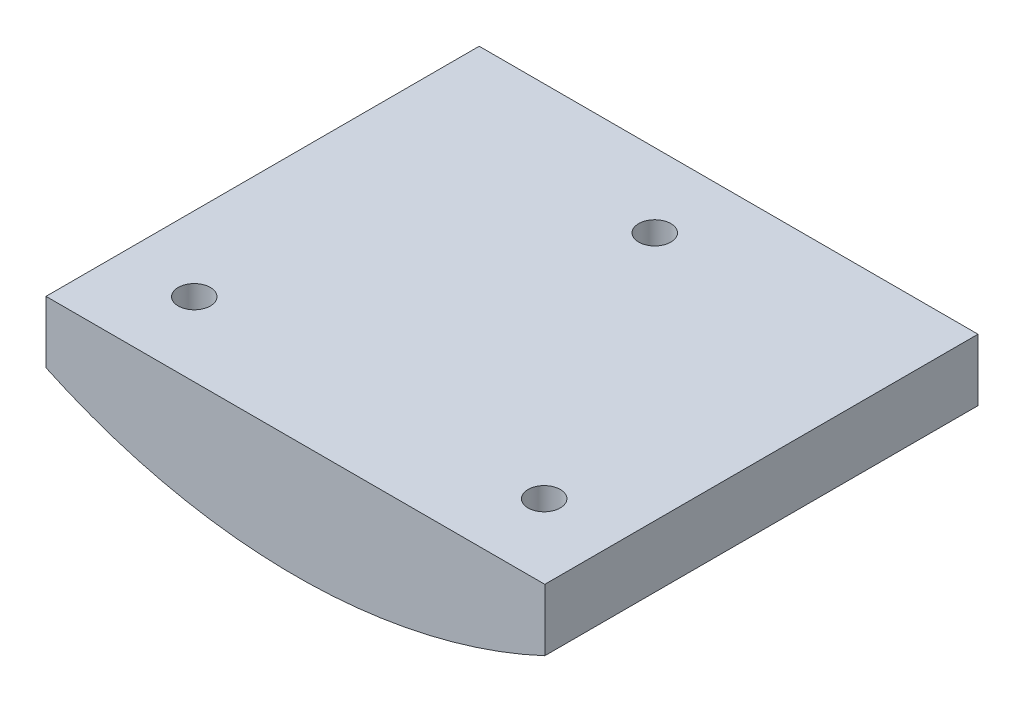
ISO-10303-21;
HEADER;
FILE_DESCRIPTION(('STEP AP214'),'2;1');
FILE_NAME('part.step','',(''),(''),'','','');
FILE_SCHEMA(('AUTOMOTIVE_DESIGN { 1 0 10303 214 1 1 1 1 }'));
ENDSEC;
DATA;
#1=APPLICATION_CONTEXT('core data for automotive mechanical design processes');
#2=APPLICATION_PROTOCOL_DEFINITION('international standard','automotive_design',2000,#1);
#3=PRODUCT_CONTEXT('',#1,'mechanical');
#4=PRODUCT('Part','Part','',(#3));
#5=PRODUCT_RELATED_PRODUCT_CATEGORY('part','',(#4));
#6=PRODUCT_DEFINITION_FORMATION('','',#4);
#7=PRODUCT_DEFINITION_CONTEXT('part definition',#1,'design');
#8=PRODUCT_DEFINITION('design','',#6,#7);
#9=PRODUCT_DEFINITION_SHAPE('','',#8);
#10=(LENGTH_UNIT() NAMED_UNIT(*) SI_UNIT(.MILLI.,.METRE.));
#11=(NAMED_UNIT(*) PLANE_ANGLE_UNIT() SI_UNIT($,.RADIAN.));
#12=(NAMED_UNIT(*) SI_UNIT($,.STERADIAN.) SOLID_ANGLE_UNIT());
#13=UNCERTAINTY_MEASURE_WITH_UNIT(LENGTH_MEASURE(1.E-05),#10,'distance_accuracy_value','');
#14=(GEOMETRIC_REPRESENTATION_CONTEXT(3) GLOBAL_UNCERTAINTY_ASSIGNED_CONTEXT((#13)) GLOBAL_UNIT_ASSIGNED_CONTEXT((#10,
#11,#12)) REPRESENTATION_CONTEXT('',''));
#15=CARTESIAN_POINT('',(0.,0.,0.));
#16=DIRECTION('',(0.,0.,1.));
#17=DIRECTION('',(1.,0.,0.));
#18=AXIS2_PLACEMENT_3D('',#15,#16,#17);
#19=CARTESIAN_POINT('',(25.5905,6.35,22.225));
#20=DIRECTION('',(-1.,0.,0.));
#21=DIRECTION('',(0.,0.,1.));
#22=AXIS2_PLACEMENT_3D('',#19,#20,#21);
#23=PLANE('',#22);
#24=DIRECTION('',(0.,0.,-1.));
#25=VECTOR('',#24,1.);
#26=CARTESIAN_POINT('',(25.5905,0.,22.225));
#27=LINE('',#26,#25);
#28=CARTESIAN_POINT('',(25.5905,0.,22.225));
#29=VERTEX_POINT('',#28);
#30=CARTESIAN_POINT('',(25.5905,0.,-22.225));
#31=VERTEX_POINT('',#30);
#32=EDGE_CURVE('E76',#29,#31,#27,.T.);
#33=ORIENTED_EDGE('',*,*,#32,.T.);
#34=DIRECTION('',(0.,-1.,0.));
#35=VECTOR('',#34,1.);
#36=CARTESIAN_POINT('',(25.5905,6.35,-22.225));
#37=LINE('',#36,#35);
#38=CARTESIAN_POINT('',(25.5905,6.35,-22.225));
#39=VERTEX_POINT('',#38);
#40=EDGE_CURVE('E49',#39,#31,#37,.T.);
#41=ORIENTED_EDGE('',*,*,#40,.F.);
#42=DIRECTION('',(0.,0.,-1.));
#43=VECTOR('',#42,1.);
#44=CARTESIAN_POINT('',(25.5905,6.35,22.225));
#45=LINE('',#44,#43);
#46=CARTESIAN_POINT('',(25.5905,6.35,22.225));
#47=VERTEX_POINT('',#46);
#48=EDGE_CURVE('E99',#47,#39,#45,.T.);
#49=ORIENTED_EDGE('',*,*,#48,.F.);
#50=DIRECTION('',(0.,-1.,0.));
#51=VECTOR('',#50,1.);
#52=CARTESIAN_POINT('',(25.5905,6.35,22.225));
#53=LINE('',#52,#51);
#54=EDGE_CURVE('E93',#47,#29,#53,.T.);
#55=ORIENTED_EDGE('',*,*,#54,.T.);
#56=EDGE_LOOP('',(#33,#41,#49,#55));
#57=FACE_BOUND('',#56,.T.);
#58=ADVANCED_FACE('F36',(#57),#23,.F.);
#59=CARTESIAN_POINT('',(-25.5905,6.35,-22.225));
#60=DIRECTION('',(0.,0.,1.));
#61=DIRECTION('',(1.,0.,0.));
#62=AXIS2_PLACEMENT_3D('',#59,#60,#61);
#63=PLANE('',#62);
#64=ORIENTED_EDGE('',*,*,#40,.T.);
#65=CARTESIAN_POINT('',(0.,54.6281240273726,-22.225));
#66=DIRECTION('',(0.,0.,1.));
#67=DIRECTION('',(1.,0.,0.));
#68=AXIS2_PLACEMENT_3D('',#65,#66,#67);
#69=CIRCLE('',#68,60.325);
#70=CARTESIAN_POINT('',(-25.5905,0.,-22.225));
#71=VERTEX_POINT('',#70);
#72=EDGE_CURVE('E83',#31,#71,#69,.F.);
#73=ORIENTED_EDGE('',*,*,#72,.T.);
#74=DIRECTION('',(0.,-1.,0.));
#75=VECTOR('',#74,1.);
#76=CARTESIAN_POINT('',(-25.5905,6.35,-22.225));
#77=LINE('',#76,#75);
#78=CARTESIAN_POINT('',(-25.5905,6.35,-22.225));
#79=VERTEX_POINT('',#78);
#80=EDGE_CURVE('E101',#79,#71,#77,.T.);
#81=ORIENTED_EDGE('',*,*,#80,.F.);
#82=DIRECTION('',(-1.,0.,0.));
#83=VECTOR('',#82,1.);
#84=CARTESIAN_POINT('',(-25.5905,6.35,-22.225));
#85=LINE('',#84,#83);
#86=EDGE_CURVE('E169',#39,#79,#85,.T.);
#87=ORIENTED_EDGE('',*,*,#86,.F.);
#88=EDGE_LOOP('',(#64,#73,#81,#87));
#89=FACE_BOUND('',#88,.T.);
#90=ADVANCED_FACE('F139',(#89),#63,.F.);
#91=CARTESIAN_POINT('',(-25.5905,6.35,22.225));
#92=DIRECTION('',(1.,0.,0.));
#93=DIRECTION('',(0.,0.,-1.));
#94=AXIS2_PLACEMENT_3D('',#91,#92,#93);
#95=PLANE('',#94);
#96=DIRECTION('',(0.,0.,1.));
#97=VECTOR('',#96,1.);
#98=CARTESIAN_POINT('',(-25.5905,0.,22.225));
#99=LINE('',#98,#97);
#100=CARTESIAN_POINT('',(-25.5905,0.,22.225));
#101=VERTEX_POINT('',#100);
#102=EDGE_CURVE('E88',#71,#101,#99,.T.);
#103=ORIENTED_EDGE('',*,*,#102,.T.);
#104=DIRECTION('',(0.,-1.,0.));
#105=VECTOR('',#104,1.);
#106=CARTESIAN_POINT('',(-25.5905,6.35,22.225));
#107=LINE('',#106,#105);
#108=CARTESIAN_POINT('',(-25.5905,6.35,22.225));
#109=VERTEX_POINT('',#108);
#110=EDGE_CURVE('E96',#109,#101,#107,.T.);
#111=ORIENTED_EDGE('',*,*,#110,.F.);
#112=DIRECTION('',(0.,0.,1.));
#113=VECTOR('',#112,1.);
#114=CARTESIAN_POINT('',(-25.5905,6.35,22.225));
#115=LINE('',#114,#113);
#116=EDGE_CURVE('E103',#79,#109,#115,.T.);
#117=ORIENTED_EDGE('',*,*,#116,.F.);
#118=ORIENTED_EDGE('',*,*,#80,.T.);
#119=EDGE_LOOP('',(#103,#111,#117,#118));
#120=FACE_BOUND('',#119,.T.);
#121=ADVANCED_FACE('F143',(#120),#95,.F.);
#122=CARTESIAN_POINT('',(-25.5905,6.35,22.225));
#123=DIRECTION('',(0.,0.,-1.));
#124=DIRECTION('',(-1.,0.,0.));
#125=AXIS2_PLACEMENT_3D('',#122,#123,#124);
#126=PLANE('',#125);
#127=ORIENTED_EDGE('',*,*,#110,.T.);
#128=CARTESIAN_POINT('',(0.,54.6281240273726,22.225));
#129=DIRECTION('',(0.,0.,1.));
#130=DIRECTION('',(1.,0.,0.));
#131=AXIS2_PLACEMENT_3D('',#128,#129,#130);
#132=CIRCLE('',#131,60.325);
#133=EDGE_CURVE('E80',#101,#29,#132,.T.);
#134=ORIENTED_EDGE('',*,*,#133,.T.);
#135=ORIENTED_EDGE('',*,*,#54,.F.);
#136=DIRECTION('',(1.,0.,0.));
#137=VECTOR('',#136,1.);
#138=CARTESIAN_POINT('',(-25.5905,6.35,22.225));
#139=LINE('',#138,#137);
#140=EDGE_CURVE('E56',#109,#47,#139,.T.);
#141=ORIENTED_EDGE('',*,*,#140,.F.);
#142=EDGE_LOOP('',(#127,#134,#135,#141));
#143=FACE_BOUND('',#142,.T.);
#144=ADVANCED_FACE('F92',(#143),#126,.F.);
#145=CARTESIAN_POINT('',(0.,6.35,0.));
#146=DIRECTION('',(0.,-1.,0.));
#147=DIRECTION('',(0.,0.,-1.));
#148=AXIS2_PLACEMENT_3D('',#145,#146,#147);
#149=PLANE('',#148);
#150=CARTESIAN_POINT('',(0.,6.35,-14.65));
#151=DIRECTION('',(0.,1.,0.));
#152=DIRECTION('',(0.,0.,1.));
#153=AXIS2_PLACEMENT_3D('',#150,#151,#152);
#154=CIRCLE('',#153,1.65);
#155=CARTESIAN_POINT('',(0.,6.35,-13.));
#156=VERTEX_POINT('',#155);
#157=EDGE_CURVE('E162',#156,#156,#154,.T.);
#158=ORIENTED_EDGE('',*,*,#157,.F.);
#159=EDGE_LOOP('',(#158));
#160=FACE_BOUND('',#159,.T.);
#161=CARTESIAN_POINT('',(-17.950000041,6.35,14.65));
#162=DIRECTION('',(0.,1.,0.));
#163=DIRECTION('',(0.,0.,1.));
#164=AXIS2_PLACEMENT_3D('',#161,#162,#163);
#165=CIRCLE('',#164,1.65);
#166=CARTESIAN_POINT('',(-17.950000041,6.35,16.3));
#167=VERTEX_POINT('',#166);
#168=EDGE_CURVE('E166',#167,#167,#165,.T.);
#169=ORIENTED_EDGE('',*,*,#168,.F.);
#170=EDGE_LOOP('',(#169));
#171=FACE_BOUND('',#170,.T.);
#172=CARTESIAN_POINT('',(17.950000041,6.35,14.65));
#173=DIRECTION('',(0.,1.,0.));
#174=DIRECTION('',(0.,0.,1.));
#175=AXIS2_PLACEMENT_3D('',#172,#173,#174);
#176=CIRCLE('',#175,1.65);
#177=CARTESIAN_POINT('',(17.950000041,6.35,16.3));
#178=VERTEX_POINT('',#177);
#179=EDGE_CURVE('E115',#178,#178,#176,.T.);
#180=ORIENTED_EDGE('',*,*,#179,.F.);
#181=EDGE_LOOP('',(#180));
#182=FACE_BOUND('',#181,.T.);
#183=ORIENTED_EDGE('',*,*,#48,.T.);
#184=ORIENTED_EDGE('',*,*,#86,.T.);
#185=ORIENTED_EDGE('',*,*,#116,.T.);
#186=ORIENTED_EDGE('',*,*,#140,.T.);
#187=EDGE_LOOP('',(#183,#184,#185,#186));
#188=FACE_BOUND('',#187,.T.);
#189=ADVANCED_FACE('F152',(#160,#171,#182,#188),#149,.F.);
#190=CARTESIAN_POINT('',(0.,54.6281240273726,-73.7220791098631));
#191=DIRECTION('',(0.,0.,1.));
#192=DIRECTION('',(1.,0.,0.));
#193=AXIS2_PLACEMENT_3D('',#190,#191,#192);
#194=CYLINDRICAL_SURFACE('',#193,60.325);
#195=CARTESIAN_POINT('',(0.,-5.69687597262743,-13.));
#196=CARTESIAN_POINT('',(-0.0926626311466883,-5.69687566841673,-13.0000041035143));
#197=CARTESIAN_POINT('',(-0.185392010225587,-5.69666017928202,-13.0078319841645));
#198=CARTESIAN_POINT('',(-0.368295677779941,-5.69582126613613,-13.0389496126896));
#199=CARTESIAN_POINT('',(-0.458466775571824,-5.69519735422712,-13.0622578537371));
#200=CARTESIAN_POINT('',(-0.633577679482318,-5.6936122556872,-13.1236710305065));
#201=CARTESIAN_POINT('',(-0.718520011188235,-5.69265123341331,-13.1617687566289));
#202=CARTESIAN_POINT('',(-0.880779667870997,-5.6905003312531,-13.2516691816144));
#203=CARTESIAN_POINT('',(-0.958098853700856,-5.68931050742882,-13.3034685244084));
#204=CARTESIAN_POINT('',(-1.10297245181242,-5.6868354498851,-13.4193265799242));
#205=CARTESIAN_POINT('',(-1.17052355318621,-5.68555018403781,-13.4833894323642));
#206=CARTESIAN_POINT('',(-1.29391569605549,-5.68302938471399,-13.6219490477603));
#207=CARTESIAN_POINT('',(-1.34975627228516,-5.68179385321501,-13.6964462250821));
#208=CARTESIAN_POINT('',(-1.44814644640664,-5.67951170833309,-13.8537708235547));
#209=CARTESIAN_POINT('',(-1.49069420593981,-5.67846512108903,-13.9365993948215));
#210=CARTESIAN_POINT('',(-1.56127894295209,-5.6766791546928,-14.1082273508255));
#211=CARTESIAN_POINT('',(-1.58931597373297,-5.67593977441217,-14.1970267136291));
#212=CARTESIAN_POINT('',(-1.63007667613815,-5.67485181183432,-14.3780519344276));
#213=CARTESIAN_POINT('',(-1.64280419978553,-5.67450313123471,-14.470276924478));
#214=CARTESIAN_POINT('',(-1.65259646001082,-5.67423558697723,-14.6555550778472));
#215=CARTESIAN_POINT('',(-1.64966125332291,-5.67431672176246,-14.7486082381648));
#216=CARTESIAN_POINT('',(-1.62821464732167,-5.67489956728278,-14.9328751567203));
#217=CARTESIAN_POINT('',(-1.6097074166235,-5.6754011654601,-15.0240894005435));
#218=CARTESIAN_POINT('',(-1.55764855979074,-5.67676821461024,-15.2021158243787));
#219=CARTESIAN_POINT('',(-1.52409690344156,-5.67763366631381,-15.2889279955493));
#220=CARTESIAN_POINT('',(-1.4428968235162,-5.67963098884429,-15.4556993696752));
#221=CARTESIAN_POINT('',(-1.39524648863435,-5.68076289578929,-15.5356576415759));
#222=CARTESIAN_POINT('',(-1.28720310364604,-5.68316548853987,-15.6864412593329));
#223=CARTESIAN_POINT('',(-1.22681003020602,-5.68443617459956,-15.7572665884653));
#224=CARTESIAN_POINT('',(-1.09497191858974,-5.68697358003107,-15.887798140525));
#225=CARTESIAN_POINT('',(-1.02352326407619,-5.68824029796607,-15.9475007110064));
#226=CARTESIAN_POINT('',(-0.871614928701299,-5.69062656510432,-16.0540638783152));
#227=CARTESIAN_POINT('',(-0.791155246434087,-5.69174611428462,-16.100924473139));
#228=CARTESIAN_POINT('',(-0.623506812513408,-5.69371185031849,-16.1804730614033));
#229=CARTESIAN_POINT('',(-0.53631800696668,-5.69455803498241,-16.2131609413213));
#230=CARTESIAN_POINT('',(-0.35768722917547,-5.69588161714132,-16.2634338766797));
#231=CARTESIAN_POINT('',(-0.266245266587046,-5.69635901547353,-16.2810189664067));
#232=CARTESIAN_POINT('',(-0.0817356356630626,-5.69689110235541,-16.3005826688568));
#233=CARTESIAN_POINT('',(0.0113314964689499,-5.69694592778176,-16.3025663350817));
#234=CARTESIAN_POINT('',(0.196477480154455,-5.6966270510299,-16.2908840485183));
#235=CARTESIAN_POINT('',(0.288556332652152,-5.69625334926114,-16.2772181106829));
#236=CARTESIAN_POINT('',(0.469097871212851,-5.69511962561093,-16.2346287268158));
#237=CARTESIAN_POINT('',(0.557561098620252,-5.69435966179266,-16.2057075739334));
#238=CARTESIAN_POINT('',(0.728376832788368,-5.69253905790012,-16.133431060049));
#239=CARTESIAN_POINT('',(0.81072932947472,-5.69147841733016,-16.0900756752508));
#240=CARTESIAN_POINT('',(0.967009164926633,-5.68917561783584,-15.9901483887582));
#241=CARTESIAN_POINT('',(1.04093432774382,-5.68793341221924,-15.933573085112));
#242=CARTESIAN_POINT('',(1.17823917207032,-5.68540764360013,-15.8088169283221));
#243=CARTESIAN_POINT('',(1.24161883046894,-5.68412408050699,-15.7406360497451));
#244=CARTESIAN_POINT('',(1.3560503950021,-5.68165990948103,-15.5945825123814));
#245=CARTESIAN_POINT('',(1.40709904038704,-5.68047932883298,-15.5167072983061));
#246=CARTESIAN_POINT('',(1.49539718349718,-5.67835465710354,-15.3534887628079));
#247=CARTESIAN_POINT('',(1.53264670952923,-5.67741056553703,-15.268145456705));
#248=CARTESIAN_POINT('',(1.59228352912558,-5.67586551028449,-15.0924256176313));
#249=CARTESIAN_POINT('',(1.61467293614314,-5.67526449780636,-15.0020498023824));
#250=CARTESIAN_POINT('',(1.64396089662116,-5.67447322575632,-14.8188201851997));
#251=CARTESIAN_POINT('',(1.65085945669165,-5.67428296600914,-14.7259663843232));
#252=CARTESIAN_POINT('',(1.64896964400493,-5.67433466843075,-14.5404492874223));
#253=CARTESIAN_POINT('',(1.6401864187113,-5.67457648877156,-14.4477859388779));
#254=CARTESIAN_POINT('',(1.6071929332385,-5.67546479230442,-14.2652495438555));
#255=CARTESIAN_POINT('',(1.58298264239229,-5.6761112763009,-14.1753765029246));
#256=CARTESIAN_POINT('',(1.51982287493475,-5.67773600894371,-14.0009696706459));
#257=CARTESIAN_POINT('',(1.48087314488832,-5.67871426329459,-13.9164359711339));
#258=CARTESIAN_POINT('',(1.3893421992406,-5.68089221151032,-13.7551095842019));
#259=CARTESIAN_POINT('',(1.33676148371929,-5.68209189725106,-13.6783166129413));
#260=CARTESIAN_POINT('',(1.21944708056404,-5.68457784463049,-13.5346285778817));
#261=CARTESIAN_POINT('',(1.15471070049798,-5.68586412540909,-13.4677357127985));
#262=CARTESIAN_POINT('',(1.01490770411413,-5.68837839322178,-13.3457494615462));
#263=CARTESIAN_POINT('',(0.939838532249391,-5.68960636573348,-13.2906590030388));
#264=CARTESIAN_POINT('',(0.781474289894267,-5.69186597478468,-13.1938335513307));
#265=CARTESIAN_POINT('',(0.698174154162481,-5.69289748926884,-13.1521068498593));
#266=CARTESIAN_POINT('',(0.525812383544848,-5.69464566394987,-13.0832794730061));
#267=CARTESIAN_POINT('',(0.43675776831481,-5.69536269974787,-13.0561613408263));
#268=CARTESIAN_POINT('',(0.289283133601821,-5.6962092967992,-13.0245143647204));
#269=CARTESIAN_POINT('',(0.231820520196926,-5.6964582167958,-13.0153330291691));
#270=CARTESIAN_POINT('',(0.116247362521215,-5.69679165012123,-13.0030745602747));
#271=CARTESIAN_POINT('',(0.0581368184084313,-5.69687616349016,-12.9999974254426));
#272=CARTESIAN_POINT('',(0.,-5.69687597262743,-13.));
#273=B_SPLINE_CURVE_WITH_KNOTS('',3,(#195,#196,#197,#198,#199,#200,#201,#202,#203,#204,#205,
#206,#207,#208,#209,#210,#211,#212,#213,#214,#215,#216,#217,#218,#219,#220,#221,#222,#223,#224,
#225,#226,#227,#228,#229,#230,#231,#232,#233,#234,#235,#236,#237,#238,#239,#240,#241,#242,#243,
#244,#245,#246,#247,#248,#249,#250,#251,#252,#253,#254,#255,#256,#257,#258,#259,#260,#261,#262,
#263,#264,#265,#266,#267,#268,#269,#270,#271,#272),.UNSPECIFIED.,.T.,.F.,(4,2,2,2,2,2,2,2,2,2,2,
2,2,2,2,2,2,2,2,2,2,2,2,2,2,2,2,2,2,2,2,2,2,2,2,2,2,2,4),(0.,0.277775687801012,
0.555883810747942,0.833856531047044,1.11176122775413,1.38975990101023,1.66776961722025,
1.94581776437923,2.22386489018633,2.50184204194911,2.77981818681234,3.05771994140791,
3.33562225413213,3.6135622583195,3.89150277145419,4.16953439330329,4.44756605853021,
4.72559995073205,5.00363321173682,5.28157641048008,5.55951934365226,5.83742050861195,
6.11532213171897,6.39329534763247,6.67126917272208,6.94931642350693,7.22736310391551,
7.50537023116437,7.78337723978609,8.06129301084544,8.3392093343679,8.6171304366988,
8.89504134438074,9.17301388100874,9.45105529085107,9.7292688826394,10.0071492759565,
10.1814266352202,10.3557039519781),.UNSPECIFIED.);
#274=CARTESIAN_POINT('',(0.,-5.69687597262743,-13.));
#275=VERTEX_POINT('',#274);
#276=EDGE_CURVE('E11',#275,#275,#273,.T.);
#277=ORIENTED_EDGE('',*,*,#276,.F.);
#278=EDGE_LOOP('',(#277));
#279=FACE_BOUND('',#278,.T.);
#280=CARTESIAN_POINT('',(-17.950000041,-2.96443732848397,16.3));
#281=CARTESIAN_POINT('',(-18.0465739976153,-2.93433752207203,16.2999961913821));
#282=CARTESIAN_POINT('',(-18.1431454006504,-2.90396994684783,16.2914989425646));
#283=CARTESIAN_POINT('',(-18.3335278320595,-2.84358545705151,16.2577237523911));
#284=CARTESIAN_POINT('',(-18.427334954864,-2.81356907165476,16.2324231556002));
#285=CARTESIAN_POINT('',(-18.6094632552787,-2.75482342753763,16.1655907265399));
#286=CARTESIAN_POINT('',(-18.6977829627441,-2.72609451431624,16.1240545661133));
#287=CARTESIAN_POINT('',(-18.8662235435949,-2.6709082142711,16.0256967601914));
#288=CARTESIAN_POINT('',(-18.9463472768976,-2.64445003561567,15.9688804718584));
#289=CARTESIAN_POINT('',(-19.0943665163954,-2.59526950661903,15.842563030745));
#290=CARTESIAN_POINT('',(-19.1624692937866,-2.57248457990218,15.7733296726432));
#291=CARTESIAN_POINT('',(-19.2859384850963,-2.5309737276831,15.6232432963214));
#292=CARTESIAN_POINT('',(-19.3413080286876,-2.51224680483871,15.5423931413227));
#293=CARTESIAN_POINT('',(-19.4348330293431,-2.48050246456456,15.3755795606312));
#294=CARTESIAN_POINT('',(-19.4736960815076,-2.4672512152494,15.2900575496508));
#295=CARTESIAN_POINT('',(-19.5364574744797,-2.44580667323721,15.1130949211796));
#296=CARTESIAN_POINT('',(-19.5603610047062,-2.43761162657071,15.0216563682804));
#297=CARTESIAN_POINT('',(-19.5914398189006,-2.42694908257132,14.8403161260041));
#298=CARTESIAN_POINT('',(-19.5993808690077,-2.42421942227447,14.7505604734176));
#299=CARTESIAN_POINT('',(-19.6005491098847,-2.42381811156582,14.5709494485134));
#300=CARTESIAN_POINT('',(-19.5937787151326,-2.42614563115733,14.481094094978));
#301=CARTESIAN_POINT('',(-19.5660988864006,-2.43564383065569,14.3058735385));
#302=CARTESIAN_POINT('',(-19.5454995451506,-2.44270828801483,14.2204532077021));
#303=CARTESIAN_POINT('',(-19.4912271838789,-2.46126644213906,14.054390247198));
#304=CARTESIAN_POINT('',(-19.4575535516837,-2.47276034630262,13.9737478414109));
#305=CARTESIAN_POINT('',(-19.3776146719021,-2.49993805845116,13.818011433478));
#306=CARTESIAN_POINT('',(-19.331149515383,-2.51568830708362,13.7430318765626));
#307=CARTESIAN_POINT('',(-19.2273817994129,-2.55068678358665,13.6019203782698));
#308=CARTESIAN_POINT('',(-19.1700771964207,-2.56993567102243,13.5357901092532));
#309=CARTESIAN_POINT('',(-19.0435406452624,-2.61219235046942,13.411086919753));
#310=CARTESIAN_POINT('',(-18.9738911941718,-2.63532936009856,13.352981676313));
#311=CARTESIAN_POINT('',(-18.8265966186612,-2.68392442177134,13.2492143301567));
#312=CARTESIAN_POINT('',(-18.7489495444181,-2.70938303964953,13.2035552717651));
#313=CARTESIAN_POINT('',(-18.5836606808674,-2.76317405330829,13.1236265229357));
#314=CARTESIAN_POINT('',(-18.4957129627239,-2.7915865368615,13.0900426838185));
#315=CARTESIAN_POINT('',(-18.3156569790704,-2.8492739142621,13.0383008120357));
#316=CARTESIAN_POINT('',(-18.2235478783573,-2.87854898081892,13.0201458906188));
#317=CARTESIAN_POINT('',(-18.0345338655305,-2.93811036628815,12.9993378724685));
#318=CARTESIAN_POINT('',(-17.9375707982034,-2.96839832058661,12.9972134715424));
#319=CARTESIAN_POINT('',(-17.7445115182403,-3.02816921527735,13.0099895642389));
#320=CARTESIAN_POINT('',(-17.6484153608709,-3.05765210458535,13.0248911356624));
#321=CARTESIAN_POINT('',(-17.459655688657,-3.1150643480215,13.0715407836823));
#322=CARTESIAN_POINT('',(-17.3670002798836,-3.1429901027588,13.10332623827));
#323=CARTESIAN_POINT('',(-17.1881984652457,-3.1964397015116,13.1831194872467));
#324=CARTESIAN_POINT('',(-17.1020512912308,-3.22196382907263,13.2311253635087));
#325=CARTESIAN_POINT('',(-16.9412489898526,-3.26925551935047,13.340748437898));
#326=CARTESIAN_POINT('',(-16.8663509056715,-3.29110433007353,13.4019737498848));
#327=CARTESIAN_POINT('',(-16.7279424922206,-3.33123041244135,13.5371542311736));
#328=CARTESIAN_POINT('',(-16.6644294916658,-3.3495085219712,13.6111064063663));
#329=CARTESIAN_POINT('',(-16.5533730739726,-3.38131208725223,13.7664389938581));
#330=CARTESIAN_POINT('',(-16.505289150372,-3.39499941476582,13.8473998406895));
#331=CARTESIAN_POINT('',(-16.4234321050638,-3.41822231689209,14.016806950846));
#332=CARTESIAN_POINT('',(-16.3896556728671,-3.42775885193548,14.1052514768976));
#333=CARTESIAN_POINT('',(-16.3386115170473,-3.44214444342764,14.2836381864857));
#334=CARTESIAN_POINT('',(-16.3207880259198,-3.447151375716,14.3734088940388));
#335=CARTESIAN_POINT('',(-16.3002235787933,-3.45292670766595,14.5547920114267));
#336=CARTESIAN_POINT('',(-16.2974805401388,-3.45369569260069,14.6464041651983));
#337=CARTESIAN_POINT('',(-16.3070766896794,-3.45100213378012,14.8269725484434));
#338=CARTESIAN_POINT('',(-16.3191231758048,-3.44762171189729,14.9159457548066));
#339=CARTESIAN_POINT('',(-16.3573869672027,-3.43685601415175,15.0905332705179));
#340=CARTESIAN_POINT('',(-16.3836040368926,-3.42947080486765,15.1761476356805));
#341=CARTESIAN_POINT('',(-16.449410838068,-3.41086004858348,15.3418843018263));
#342=CARTESIAN_POINT('',(-16.4890361366502,-3.39962428645883,15.4219913066358));
#343=CARTESIAN_POINT('',(-16.5803460041038,-3.37360005629351,15.5743583244535));
#344=CARTESIAN_POINT('',(-16.6320311129906,-3.35881142916144,15.6466179858602));
#345=CARTESIAN_POINT('',(-16.7471812177215,-3.32566108317931,15.7830846408664));
#346=CARTESIAN_POINT('',(-16.810891129764,-3.30722460019096,15.8470665976527));
#347=CARTESIAN_POINT('',(-16.9473447765821,-3.26745589390348,15.963480398313));
#348=CARTESIAN_POINT('',(-17.0200921917077,-3.24612249055774,16.0159075124303));
#349=CARTESIAN_POINT('',(-17.1753851351876,-3.20023028440528,16.1097983074267));
#350=CARTESIAN_POINT('',(-17.2581950812274,-3.17558079502992,16.1507795632932));
#351=CARTESIAN_POINT('',(-17.4288809090002,-3.12434475983088,16.2182292610913));
#352=CARTESIAN_POINT('',(-17.5167518854761,-3.09776008324886,16.2447115026263));
#353=CARTESIAN_POINT('',(-17.6625843038335,-3.05326175064701,16.2758079214121));
#354=CARTESIAN_POINT('',(-17.7197518615101,-3.03572624945196,16.2848761600635));
#355=CARTESIAN_POINT('',(-17.8346132573655,-3.00030479979957,16.2969733904633));
#356=CARTESIAN_POINT('',(-17.8923071048468,-2.98241884514135,16.3000022752547));
#357=CARTESIAN_POINT('',(-17.950000041,-2.96443732848397,16.3));
#358=B_SPLINE_CURVE_WITH_KNOTS('',3,(#280,#281,#282,#283,#284,#285,#286,#287,#288,#289,#290,
#291,#292,#293,#294,#295,#296,#297,#298,#299,#300,#301,#302,#303,#304,#305,#306,#307,#308,#309,
#310,#311,#312,#313,#314,#315,#316,#317,#318,#319,#320,#321,#322,#323,#324,#325,#326,#327,#328,
#329,#330,#331,#332,#333,#334,#335,#336,#337,#338,#339,#340,#341,#342,#343,#344,#345,#346,#347,
#348,#349,#350,#351,#352,#353,#354,#355,#356,#357),.UNSPECIFIED.,.T.,.F.,(4,2,2,2,2,2,2,2,2,2,2,
2,2,2,2,2,2,2,2,2,2,2,2,2,2,2,2,2,2,2,2,2,2,2,2,2,2,2,4),(0.,0.303249742214176,
0.606909178963837,0.91064962202343,1.21428371319942,1.51202067735174,1.80968438300616,
2.09283704440222,2.3758914263575,2.64500775256286,2.91407991407751,3.17731157903404,
3.44055557069376,3.70817324944235,3.97584143204236,4.25542922160062,4.53508533681915,
4.82876342092731,5.12250071132105,5.42588497525994,5.72928844549888,6.03336641509961,
6.3374084388976,6.63344090969125,6.92940383114082,7.21343718062666,7.49740477409997,
7.7710439719386,8.04464537844234,8.31291810396768,8.58118636966125,8.85017190478523,
9.11916948688021,9.39439181348015,9.66972658877174,9.95534148684774,10.240684073005,
10.4218411757526,10.6030014867641),.UNSPECIFIED.);
#359=CARTESIAN_POINT('',(-17.950000041,-2.96443732848397,16.3));
#360=VERTEX_POINT('',#359);
#361=EDGE_CURVE('E116',#360,#360,#358,.T.);
#362=ORIENTED_EDGE('',*,*,#361,.F.);
#363=EDGE_LOOP('',(#362));
#364=FACE_BOUND('',#363,.T.);
#365=CARTESIAN_POINT('',(17.950000041,-2.96443732848398,16.3));
#366=CARTESIAN_POINT('',(17.8544911689902,-2.99420442562313,16.2999963412486));
#367=CARTESIAN_POINT('',(17.7588405804204,-3.02375305206467,16.2916861763549));
#368=CARTESIAN_POINT('',(17.5699681439527,-3.08159464400459,16.258504658398));
#369=CARTESIAN_POINT('',(17.4767492080222,-3.10988613020399,16.2336143183171));
#370=CARTESIAN_POINT('',(17.2954600700003,-3.16445034542186,16.1676899073945));
#371=CARTESIAN_POINT('',(17.2073939158655,-3.19072149224923,16.1266433349447));
#372=CARTESIAN_POINT('',(17.0392759014326,-3.24048917874383,16.0293151798786));
#373=CARTESIAN_POINT('',(16.9592212237763,-3.26398669432645,15.9730389789661));
#374=CARTESIAN_POINT('',(16.8117188247722,-3.30699051153935,15.8482919652564));
#375=CARTESIAN_POINT('',(16.743999088206,-3.32658415981207,15.780173310345));
#376=CARTESIAN_POINT('',(16.6210265775571,-3.3619717325632,15.6326221627925));
#377=CARTESIAN_POINT('',(16.5657713675317,-3.37776639951666,15.5531918857403));
#378=CARTESIAN_POINT('',(16.4717170046849,-3.40454321209882,15.3887709721463));
#379=CARTESIAN_POINT('',(16.4323385882767,-3.41569536793693,15.3041392563039));
#380=CARTESIAN_POINT('',(16.3683258259268,-3.43377958011646,15.1290502338115));
#381=CARTESIAN_POINT('',(16.3436883190546,-3.44071254119601,15.0385941807));
#382=CARTESIAN_POINT('',(16.310610489162,-3.45001211345074,14.8575872074387));
#383=CARTESIAN_POINT('',(16.3016708374825,-3.45251951016023,14.7671344827615));
#384=CARTESIAN_POINT('',(16.298756619779,-3.45333739891421,14.5859738458164));
#385=CARTESIAN_POINT('',(16.3047804636583,-3.45164833689565,14.4952659616862));
#386=CARTESIAN_POINT('',(16.3313980551845,-3.44416924585577,14.3174249096725));
#387=CARTESIAN_POINT('',(16.3517982469475,-3.43843369556516,14.2302603457843));
#388=CARTESIAN_POINT('',(16.4062603838514,-3.42306923874331,14.0606787456249));
#389=CARTESIAN_POINT('',(16.4403225211081,-3.41344027746247,13.9782617761337));
#390=CARTESIAN_POINT('',(16.5213532380529,-3.39042725939216,13.8196560589571));
#391=CARTESIAN_POINT('',(16.568436347916,-3.37700985709325,13.7435307515516));
#392=CARTESIAN_POINT('',(16.6738635852984,-3.34679207589106,13.6002918741255));
#393=CARTESIAN_POINT('',(16.7322089830204,-3.32999131539084,13.5331793220462));
#394=CARTESIAN_POINT('',(16.8601832632452,-3.29289458417889,13.4078055824095));
#395=CARTESIAN_POINT('',(16.930083693832,-3.27251348809259,13.3498469826298));
#396=CARTESIAN_POINT('',(17.0778506190965,-3.22910170527525,13.2464357379437));
#397=CARTESIAN_POINT('',(17.1557185394967,-3.20607054424283,13.2009853366731));
#398=CARTESIAN_POINT('',(17.3204016247556,-3.15696892811937,13.1220064421837));
#399=CARTESIAN_POINT('',(17.4074467910949,-3.13081518859795,13.0890093350714));
#400=CARTESIAN_POINT('',(17.5853698982099,-3.07689338447204,13.0381341768683));
#401=CARTESIAN_POINT('',(17.6762485956492,-3.04912500075539,13.0202591253718));
#402=CARTESIAN_POINT('',(17.8627793770001,-2.99163472170432,12.9995411418688));
#403=CARTESIAN_POINT('',(17.9584846757552,-2.9618785153016,12.9972701741066));
#404=CARTESIAN_POINT('',(18.1488067660857,-2.90218442994921,13.0092468225923));
#405=CARTESIAN_POINT('',(18.2434233917169,-2.87224652433856,13.023496924292));
#406=CARTESIAN_POINT('',(18.430695213293,-2.81249692407221,13.0685841983881));
#407=CARTESIAN_POINT('',(18.5232824641645,-2.7826976471869,13.0997212209139));
#408=CARTESIAN_POINT('',(18.7019578784848,-2.72474185398802,13.1780712660991));
#409=CARTESIAN_POINT('',(18.7880460422691,-2.69658533758963,13.2252842879284));
#410=CARTESIAN_POINT('',(18.9500445463815,-2.64323556115491,13.3340178490373));
#411=CARTESIAN_POINT('',(19.0260676445917,-2.61800994528718,13.3953541200344));
#412=CARTESIAN_POINT('',(19.1666389539821,-2.57109866713999,13.53114702131));
#413=CARTESIAN_POINT('',(19.2311898908682,-2.54941216409226,13.6056005266309));
#414=CARTESIAN_POINT('',(19.3439874122381,-2.51134727139403,13.7621872049677));
#415=CARTESIAN_POINT('',(19.3928104925369,-2.49478240821534,13.8438593084584));
#416=CARTESIAN_POINT('',(19.4759109435703,-2.46650319075727,14.0150669501752));
#417=CARTESIAN_POINT('',(19.5101935622463,-2.45478708650155,14.1045996372545));
#418=CARTESIAN_POINT('',(19.561432031355,-2.43724813607294,14.2839090205804));
#419=CARTESIAN_POINT('',(19.5792030917697,-2.43114817069722,14.3734260994731));
#420=CARTESIAN_POINT('',(19.5997382416275,-2.42409774439057,14.5543585431156));
#421=CARTESIAN_POINT('',(19.602505803703,-2.42314609185782,14.6457734636833));
#422=CARTESIAN_POINT('',(19.5930891986369,-2.42638060995498,14.8247048309605));
#423=CARTESIAN_POINT('',(19.5813938364897,-2.43039881451271,14.9122506049752));
#424=CARTESIAN_POINT('',(19.5443139360106,-2.44311038676953,15.0840323084037));
#425=CARTESIAN_POINT('',(19.5189295697423,-2.451803695705,15.1682682794056));
#426=CARTESIAN_POINT('',(19.4552348357722,-2.47354487896406,15.3315291535136));
#427=CARTESIAN_POINT('',(19.4168669471954,-2.48661212830391,15.4105289631254));
#428=CARTESIAN_POINT('',(19.3285192091597,-2.51657072575711,15.5609309043632));
#429=CARTESIAN_POINT('',(19.2785380764298,-2.53346249647724,15.6323321950759));
#430=CARTESIAN_POINT('',(19.1664215375382,-2.57115506431021,15.7684275456401));
#431=CARTESIAN_POINT('',(19.1039005689382,-2.59207871571069,15.8327695856364));
#432=CARTESIAN_POINT('',(18.9698402226345,-2.63666247324961,15.9501422799411));
#433=CARTESIAN_POINT('',(18.8982965756183,-2.66032387438443,16.0031675472374));
#434=CARTESIAN_POINT('',(18.7442740821726,-2.71090902609652,16.0992365362413));
#435=CARTESIAN_POINT('',(18.66142185049,-2.73793802573011,16.1416256841336));
#436=CARTESIAN_POINT('',(18.4902454055126,-2.79333989748337,16.2117870459968));
#437=CARTESIAN_POINT('',(18.4019261938628,-2.82171153580861,16.2395724060967));
#438=CARTESIAN_POINT('',(18.2526526163732,-2.86926897975341,16.2731493323202));
#439=CARTESIAN_POINT('',(18.1925749625932,-2.88830715351627,16.2832040281988));
#440=CARTESIAN_POINT('',(18.0716840895518,-2.92640557420167,16.2966306326814));
#441=CARTESIAN_POINT('',(18.0108708472967,-2.94546582179727,16.3000023318373));
#442=CARTESIAN_POINT('',(17.950000041,-2.96443732848398,16.3));
#443=B_SPLINE_CURVE_WITH_KNOTS('',3,(#365,#366,#367,#368,#369,#370,#371,#372,#373,#374,#375,
#376,#377,#378,#379,#380,#381,#382,#383,#384,#385,#386,#387,#388,#389,#390,#391,#392,#393,#394,
#395,#396,#397,#398,#399,#400,#401,#402,#403,#404,#405,#406,#407,#408,#409,#410,#411,#412,#413,
#414,#415,#416,#417,#418,#419,#420,#421,#422,#423,#424,#425,#426,#427,#428,#429,#430,#431,#432,
#433,#434,#435,#436,#437,#438,#439,#440,#441,#442),.UNSPECIFIED.,.T.,.F.,(4,2,2,2,2,2,2,2,2,2,2,
2,2,2,2,2,2,2,2,2,2,2,2,2,2,2,2,2,2,2,2,2,2,2,2,2,2,2,4),(0.,0.299894141459754,0.60013230261433,
0.900603244663082,1.20096814743208,1.49358209976622,1.78613881691051,2.0667632237812,
2.34732743406117,2.6187936124419,2.89023094468531,3.15808192136716,3.425936664733,
3.69622675494951,3.96654734731551,4.24448260857193,4.52246769152312,4.81124567075806,
5.10008091825343,5.39944942036382,5.69886296571879,6.00377588861912,6.30868879577569,
6.60982875005588,6.91089705964065,7.19916562487104,7.4873300595316,7.76036489325964,
8.03333652905497,8.29732945433167,8.56131906143239,8.82649387542443,9.09169800535004,
9.36684928272892,9.64213124696567,9.93158823500447,10.2207842096287,10.4119101827809,
10.6030421458142),.UNSPECIFIED.);
#444=CARTESIAN_POINT('',(17.950000041,-2.96443732848398,16.3));
#445=VERTEX_POINT('',#444);
#446=EDGE_CURVE('E97',#445,#445,#443,.T.);
#447=ORIENTED_EDGE('',*,*,#446,.F.);
#448=EDGE_LOOP('',(#447));
#449=FACE_BOUND('',#448,.T.);
#450=ORIENTED_EDGE('',*,*,#72,.F.);
#451=ORIENTED_EDGE('',*,*,#32,.F.);
#452=ORIENTED_EDGE('',*,*,#133,.F.);
#453=ORIENTED_EDGE('',*,*,#102,.F.);
#454=EDGE_LOOP('',(#450,#451,#452,#453));
#455=FACE_BOUND('',#454,.T.);
#456=ADVANCED_FACE('F78',(#279,#364,#449,#455),#194,.T.);
#457=CARTESIAN_POINT('',(17.950000041,6.35,14.65));
#458=DIRECTION('',(0.,1.,0.));
#459=DIRECTION('',(0.,0.,1.));
#460=AXIS2_PLACEMENT_3D('',#457,#458,#459);
#461=CYLINDRICAL_SURFACE('',#460,1.65);
#462=ORIENTED_EDGE('',*,*,#446,.T.);
#463=EDGE_LOOP('',(#462));
#464=FACE_BOUND('',#463,.T.);
#465=ORIENTED_EDGE('',*,*,#179,.T.);
#466=EDGE_LOOP('',(#465));
#467=FACE_BOUND('',#466,.T.);
#468=ADVANCED_FACE('F123',(#464,#467),#461,.F.);
#469=CARTESIAN_POINT('',(-17.950000041,6.35,14.65));
#470=DIRECTION('',(0.,1.,0.));
#471=DIRECTION('',(0.,0.,1.));
#472=AXIS2_PLACEMENT_3D('',#469,#470,#471);
#473=CYLINDRICAL_SURFACE('',#472,1.65);
#474=ORIENTED_EDGE('',*,*,#361,.T.);
#475=EDGE_LOOP('',(#474));
#476=FACE_BOUND('',#475,.T.);
#477=ORIENTED_EDGE('',*,*,#168,.T.);
#478=EDGE_LOOP('',(#477));
#479=FACE_BOUND('',#478,.T.);
#480=ADVANCED_FACE('F126',(#476,#479),#473,.F.);
#481=CARTESIAN_POINT('',(0.,6.35,-14.65));
#482=DIRECTION('',(0.,1.,0.));
#483=DIRECTION('',(0.,0.,1.));
#484=AXIS2_PLACEMENT_3D('',#481,#482,#483);
#485=CYLINDRICAL_SURFACE('',#484,1.65);
#486=ORIENTED_EDGE('',*,*,#276,.T.);
#487=EDGE_LOOP('',(#486));
#488=FACE_BOUND('',#487,.T.);
#489=ORIENTED_EDGE('',*,*,#157,.T.);
#490=EDGE_LOOP('',(#489));
#491=FACE_BOUND('',#490,.T.);
#492=ADVANCED_FACE('F130',(#488,#491),#485,.F.);
#493=CLOSED_SHELL('',(#58,#90,#121,#144,#189,#456,#468,#480,#492));
#494=MANIFOLD_SOLID_BREP('B2',#493);
#495=ADVANCED_BREP_SHAPE_REPRESENTATION('',(#18,#494),#14);
#496=SHAPE_DEFINITION_REPRESENTATION(#9,#495);
ENDSEC;
END-ISO-10303-21;
